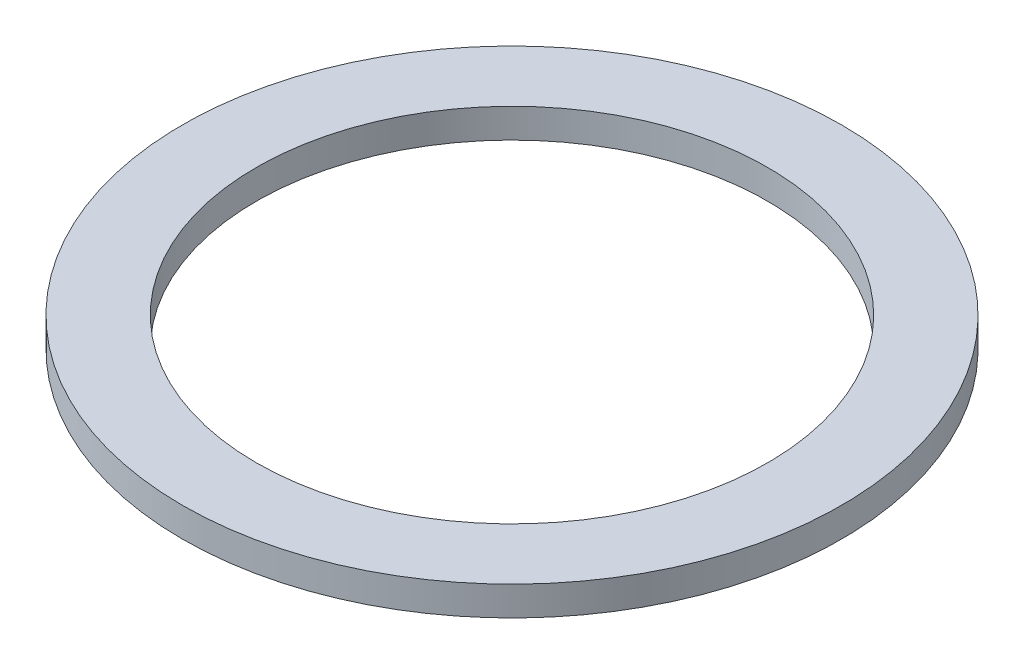
ISO-10303-21;
HEADER;
FILE_DESCRIPTION(('STEP AP214'),'2;1');
FILE_NAME('part.step','',(''),(''),'','','');
FILE_SCHEMA(('AUTOMOTIVE_DESIGN { 1 0 10303 214 1 1 1 1 }'));
ENDSEC;
DATA;
#1=APPLICATION_CONTEXT('core data for automotive mechanical design processes');
#2=APPLICATION_PROTOCOL_DEFINITION('international standard','automotive_design',2000,#1);
#3=PRODUCT_CONTEXT('',#1,'mechanical');
#4=PRODUCT('Part','Part','',(#3));
#5=PRODUCT_RELATED_PRODUCT_CATEGORY('part','',(#4));
#6=PRODUCT_DEFINITION_FORMATION('','',#4);
#7=PRODUCT_DEFINITION_CONTEXT('part definition',#1,'design');
#8=PRODUCT_DEFINITION('design','',#6,#7);
#9=PRODUCT_DEFINITION_SHAPE('','',#8);
#10=(LENGTH_UNIT() NAMED_UNIT(*) SI_UNIT(.MILLI.,.METRE.));
#11=(NAMED_UNIT(*) PLANE_ANGLE_UNIT() SI_UNIT($,.RADIAN.));
#12=(NAMED_UNIT(*) SI_UNIT($,.STERADIAN.) SOLID_ANGLE_UNIT());
#13=UNCERTAINTY_MEASURE_WITH_UNIT(LENGTH_MEASURE(1.E-05),#10,'distance_accuracy_value','');
#14=(GEOMETRIC_REPRESENTATION_CONTEXT(3) GLOBAL_UNCERTAINTY_ASSIGNED_CONTEXT((#13)) GLOBAL_UNIT_ASSIGNED_CONTEXT((#10,
#11,#12)) REPRESENTATION_CONTEXT('',''));
#15=CARTESIAN_POINT('',(0.,0.,0.));
#16=DIRECTION('',(0.,0.,1.));
#17=DIRECTION('',(1.,0.,0.));
#18=AXIS2_PLACEMENT_3D('',#15,#16,#17);
#19=CARTESIAN_POINT('',(0.,0.8,0.));
#20=DIRECTION('',(0.,1.,0.));
#21=DIRECTION('',(0.,0.,1.));
#22=AXIS2_PLACEMENT_3D('',#19,#20,#21);
#23=PLANE('',#22);
#24=CARTESIAN_POINT('',(0.,0.8,0.));
#25=DIRECTION('',(0.,1.,0.));
#26=DIRECTION('',(0.,0.,1.));
#27=AXIS2_PLACEMENT_3D('',#24,#25,#26);
#28=CIRCLE('',#27,9.);
#29=CARTESIAN_POINT('',(0.,0.8,9.));
#30=VERTEX_POINT('',#29);
#31=EDGE_CURVE('E10',#30,#30,#28,.T.);
#32=ORIENTED_EDGE('',*,*,#31,.T.);
#33=EDGE_LOOP('',(#32));
#34=FACE_BOUND('',#33,.T.);
#35=CARTESIAN_POINT('',(0.,0.8,0.));
#36=DIRECTION('',(0.,1.,0.));
#37=DIRECTION('',(0.,0.,1.));
#38=AXIS2_PLACEMENT_3D('',#35,#36,#37);
#39=CIRCLE('',#38,6.985);
#40=CARTESIAN_POINT('',(0.,0.8,6.985));
#41=VERTEX_POINT('',#40);
#42=EDGE_CURVE('E42',#41,#41,#39,.T.);
#43=ORIENTED_EDGE('',*,*,#42,.F.);
#44=EDGE_LOOP('',(#43));
#45=FACE_BOUND('',#44,.T.);
#46=ADVANCED_FACE('F31',(#34,#45),#23,.T.);
#47=CARTESIAN_POINT('',(0.,0.,0.));
#48=DIRECTION('',(0.,1.,0.));
#49=DIRECTION('',(0.,0.,1.));
#50=AXIS2_PLACEMENT_3D('',#47,#48,#49);
#51=PLANE('',#50);
#52=CARTESIAN_POINT('',(0.,0.,0.));
#53=DIRECTION('',(0.,1.,0.));
#54=DIRECTION('',(0.,0.,1.));
#55=AXIS2_PLACEMENT_3D('',#52,#53,#54);
#56=CIRCLE('',#55,9.);
#57=CARTESIAN_POINT('',(0.,0.,9.));
#58=VERTEX_POINT('',#57);
#59=EDGE_CURVE('E35',#58,#58,#56,.T.);
#60=ORIENTED_EDGE('',*,*,#59,.F.);
#61=EDGE_LOOP('',(#60));
#62=FACE_BOUND('',#61,.T.);
#63=CARTESIAN_POINT('',(0.,0.,0.));
#64=DIRECTION('',(0.,1.,0.));
#65=DIRECTION('',(0.,0.,1.));
#66=AXIS2_PLACEMENT_3D('',#63,#64,#65);
#67=CIRCLE('',#66,6.985);
#68=CARTESIAN_POINT('',(0.,0.,6.985));
#69=VERTEX_POINT('',#68);
#70=EDGE_CURVE('E44',#69,#69,#67,.T.);
#71=ORIENTED_EDGE('',*,*,#70,.T.);
#72=EDGE_LOOP('',(#71));
#73=FACE_BOUND('',#72,.T.);
#74=ADVANCED_FACE('F54',(#62,#73),#51,.F.);
#75=CARTESIAN_POINT('',(0.,0.8,0.));
#76=DIRECTION('',(0.,-1.,0.));
#77=DIRECTION('',(0.,0.,-1.));
#78=AXIS2_PLACEMENT_3D('',#75,#76,#77);
#79=CYLINDRICAL_SURFACE('',#78,9.);
#80=ORIENTED_EDGE('',*,*,#31,.F.);
#81=EDGE_LOOP('',(#80));
#82=FACE_BOUND('',#81,.T.);
#83=ORIENTED_EDGE('',*,*,#59,.T.);
#84=EDGE_LOOP('',(#83));
#85=FACE_BOUND('',#84,.T.);
#86=ADVANCED_FACE('F33',(#82,#85),#79,.T.);
#87=CARTESIAN_POINT('',(0.,0.8,0.));
#88=DIRECTION('',(0.,-1.,0.));
#89=DIRECTION('',(0.,0.,-1.));
#90=AXIS2_PLACEMENT_3D('',#87,#88,#89);
#91=CYLINDRICAL_SURFACE('',#90,6.985);
#92=ORIENTED_EDGE('',*,*,#42,.T.);
#93=EDGE_LOOP('',(#92));
#94=FACE_BOUND('',#93,.T.);
#95=ORIENTED_EDGE('',*,*,#70,.F.);
#96=EDGE_LOOP('',(#95));
#97=FACE_BOUND('',#96,.T.);
#98=ADVANCED_FACE('F50',(#94,#97),#91,.F.);
#99=CLOSED_SHELL('',(#46,#74,#86,#98));
#100=MANIFOLD_SOLID_BREP('B2',#99);
#101=ADVANCED_BREP_SHAPE_REPRESENTATION('',(#18,#100),#14);
#102=SHAPE_DEFINITION_REPRESENTATION(#9,#101);
ENDSEC;
END-ISO-10303-21;
